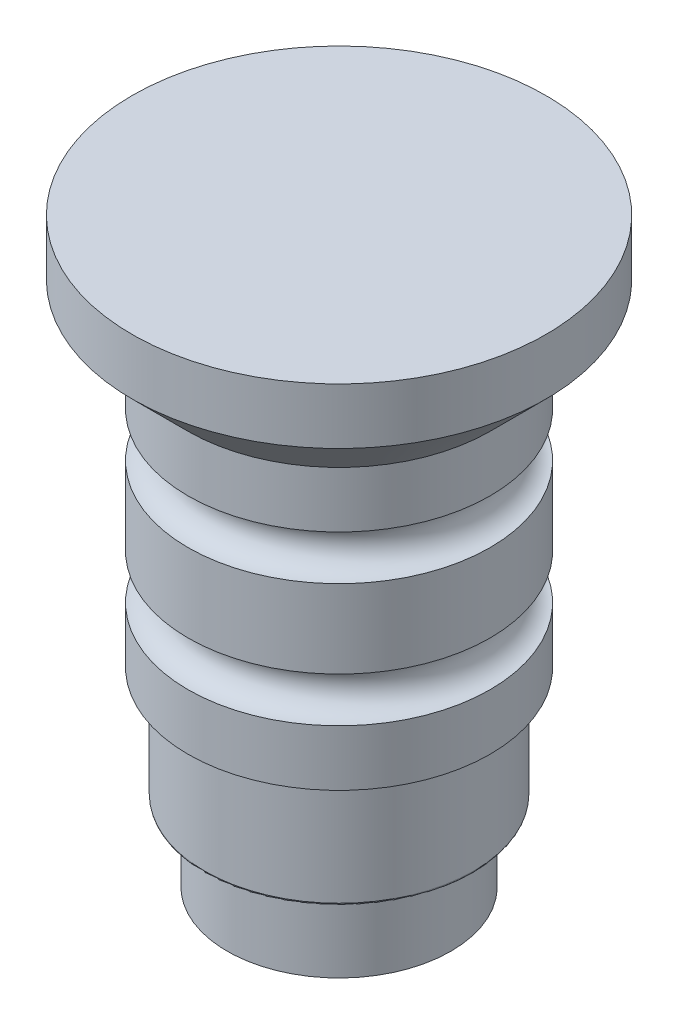
ISO-10303-21;
HEADER;
FILE_DESCRIPTION(('STEP AP214'),'2;1');
FILE_NAME('part.step','',(''),(''),'','','');
FILE_SCHEMA(('AUTOMOTIVE_DESIGN { 1 0 10303 214 1 1 1 1 }'));
ENDSEC;
DATA;
#1=APPLICATION_CONTEXT('core data for automotive mechanical design processes');
#2=APPLICATION_PROTOCOL_DEFINITION('international standard','automotive_design',2000,#1);
#3=PRODUCT_CONTEXT('',#1,'mechanical');
#4=PRODUCT('Part','Part','',(#3));
#5=PRODUCT_RELATED_PRODUCT_CATEGORY('part','',(#4));
#6=PRODUCT_DEFINITION_FORMATION('','',#4);
#7=PRODUCT_DEFINITION_CONTEXT('part definition',#1,'design');
#8=PRODUCT_DEFINITION('design','',#6,#7);
#9=PRODUCT_DEFINITION_SHAPE('','',#8);
#10=(LENGTH_UNIT() NAMED_UNIT(*) SI_UNIT(.MILLI.,.METRE.));
#11=(NAMED_UNIT(*) PLANE_ANGLE_UNIT() SI_UNIT($,.RADIAN.));
#12=(NAMED_UNIT(*) SI_UNIT($,.STERADIAN.) SOLID_ANGLE_UNIT());
#13=UNCERTAINTY_MEASURE_WITH_UNIT(LENGTH_MEASURE(1.E-05),#10,'distance_accuracy_value','');
#14=(GEOMETRIC_REPRESENTATION_CONTEXT(3) GLOBAL_UNCERTAINTY_ASSIGNED_CONTEXT((#13)) GLOBAL_UNIT_ASSIGNED_CONTEXT((#10,
#11,#12)) REPRESENTATION_CONTEXT('',''));
#15=CARTESIAN_POINT('',(0.,0.,0.));
#16=DIRECTION('',(0.,0.,1.));
#17=DIRECTION('',(1.,0.,0.));
#18=AXIS2_PLACEMENT_3D('',#15,#16,#17);
#19=CARTESIAN_POINT('',(-18.5000000000001,52.,0.));
#20=DIRECTION('',(0.,1.,0.));
#21=DIRECTION('',(-1.,0.,0.));
#22=AXIS2_PLACEMENT_3D('',#19,#20,#21);
#23=PLANE('',#22);
#24=CARTESIAN_POINT('',(0.,52.,0.));
#25=DIRECTION('',(0.,1.,0.));
#26=DIRECTION('',(-1.,0.,0.));
#27=AXIS2_PLACEMENT_3D('',#24,#25,#26);
#28=CIRCLE('',#27,18.5000000000001);
#29=CARTESIAN_POINT('',(-18.5000000000001,52.,0.));
#30=VERTEX_POINT('',#29);
#31=EDGE_CURVE('E84',#30,#30,#28,.T.);
#32=ORIENTED_EDGE('',*,*,#31,.T.);
#33=EDGE_LOOP('',(#32));
#34=FACE_BOUND('',#33,.T.);
#35=ADVANCED_FACE('F31',(#34),#23,.T.);
#36=CARTESIAN_POINT('',(-7.5,12.,0.));
#37=DIRECTION('',(0.,-1.,0.));
#38=DIRECTION('',(1.,0.,0.));
#39=AXIS2_PLACEMENT_3D('',#36,#37,#38);
#40=PLANE('',#39);
#41=CARTESIAN_POINT('',(0.,12.,0.));
#42=DIRECTION('',(0.,1.,0.));
#43=DIRECTION('',(-1.,0.,0.));
#44=AXIS2_PLACEMENT_3D('',#41,#42,#43);
#45=CIRCLE('',#44,7.5);
#46=CARTESIAN_POINT('',(-7.5,12.,0.));
#47=VERTEX_POINT('',#46);
#48=EDGE_CURVE('E51',#47,#47,#45,.T.);
#49=ORIENTED_EDGE('',*,*,#48,.F.);
#50=EDGE_LOOP('',(#49));
#51=FACE_BOUND('',#50,.T.);
#52=ADVANCED_FACE('F104',(#51),#40,.T.);
#53=CARTESIAN_POINT('',(0.,42.,0.));
#54=DIRECTION('',(0.,1.,0.));
#55=DIRECTION('',(-1.,0.,0.));
#56=AXIS2_PLACEMENT_3D('',#53,#54,#55);
#57=CYLINDRICAL_SURFACE('',#56,7.5);
#58=ORIENTED_EDGE('',*,*,#48,.T.);
#59=EDGE_LOOP('',(#58));
#60=FACE_BOUND('',#59,.T.);
#61=CARTESIAN_POINT('',(0.,0.,0.));
#62=DIRECTION('',(0.,1.,0.));
#63=DIRECTION('',(-1.,0.,0.));
#64=AXIS2_PLACEMENT_3D('',#61,#62,#63);
#65=CIRCLE('',#64,7.5);
#66=CARTESIAN_POINT('',(-7.5,0.,0.));
#67=VERTEX_POINT('',#66);
#68=EDGE_CURVE('E54',#67,#67,#65,.T.);
#69=ORIENTED_EDGE('',*,*,#68,.F.);
#70=EDGE_LOOP('',(#69));
#71=FACE_BOUND('',#70,.T.);
#72=ADVANCED_FACE('F109',(#60,#71),#57,.F.);
#73=CARTESIAN_POINT('',(-7.5,0.,0.));
#74=DIRECTION('',(0.,-1.,0.));
#75=DIRECTION('',(1.,0.,0.));
#76=AXIS2_PLACEMENT_3D('',#73,#74,#75);
#77=PLANE('',#76);
#78=ORIENTED_EDGE('',*,*,#68,.T.);
#79=EDGE_LOOP('',(#78));
#80=FACE_BOUND('',#79,.T.);
#81=CARTESIAN_POINT('',(0.,0.,0.));
#82=DIRECTION('',(0.,1.,0.));
#83=DIRECTION('',(-1.,0.,0.));
#84=AXIS2_PLACEMENT_3D('',#81,#82,#83);
#85=CIRCLE('',#84,10.);
#86=CARTESIAN_POINT('',(-10.,0.,0.));
#87=VERTEX_POINT('',#86);
#88=EDGE_CURVE('E57',#87,#87,#85,.T.);
#89=ORIENTED_EDGE('',*,*,#88,.F.);
#90=EDGE_LOOP('',(#89));
#91=FACE_BOUND('',#90,.T.);
#92=ADVANCED_FACE('F115',(#80,#91),#77,.T.);
#93=CARTESIAN_POINT('',(0.,42.,0.));
#94=DIRECTION('',(0.,1.,0.));
#95=DIRECTION('',(-1.,0.,0.));
#96=AXIS2_PLACEMENT_3D('',#93,#94,#95);
#97=CYLINDRICAL_SURFACE('',#96,10.);
#98=CARTESIAN_POINT('',(0.,6.8,0.));
#99=DIRECTION('',(0.,-1.,0.));
#100=DIRECTION('',(1.,0.,0.));
#101=AXIS2_PLACEMENT_3D('',#98,#99,#100);
#102=CIRCLE('',#101,10.);
#103=CARTESIAN_POINT('',(10.,6.8,0.));
#104=VERTEX_POINT('',#103);
#105=EDGE_CURVE('E38',#104,#104,#102,.T.);
#106=ORIENTED_EDGE('',*,*,#105,.T.);
#107=EDGE_LOOP('',(#106));
#108=FACE_BOUND('',#107,.T.);
#109=ORIENTED_EDGE('',*,*,#88,.T.);
#110=EDGE_LOOP('',(#109));
#111=FACE_BOUND('',#110,.T.);
#112=ADVANCED_FACE('F119',(#108,#111),#97,.T.);
#113=CARTESIAN_POINT('',(-10.,7.,0.));
#114=DIRECTION('',(0.,-1.,0.));
#115=DIRECTION('',(1.,0.,0.));
#116=AXIS2_PLACEMENT_3D('',#113,#114,#115);
#117=PLANE('',#116);
#118=CARTESIAN_POINT('',(0.,7.,0.));
#119=DIRECTION('',(0.,-1.,0.));
#120=DIRECTION('',(1.,0.,0.));
#121=AXIS2_PLACEMENT_3D('',#118,#119,#120);
#122=CIRCLE('',#121,10.2);
#123=CARTESIAN_POINT('',(10.2,7.,0.));
#124=VERTEX_POINT('',#123);
#125=EDGE_CURVE('E42',#124,#124,#122,.F.);
#126=ORIENTED_EDGE('',*,*,#125,.T.);
#127=EDGE_LOOP('',(#126));
#128=FACE_BOUND('',#127,.T.);
#129=CARTESIAN_POINT('',(0.,7.,0.));
#130=DIRECTION('',(0.,-1.,0.));
#131=DIRECTION('',(1.,0.,0.));
#132=AXIS2_PLACEMENT_3D('',#129,#130,#131);
#133=CIRCLE('',#132,11.8);
#134=CARTESIAN_POINT('',(11.8,7.,0.));
#135=VERTEX_POINT('',#134);
#136=EDGE_CURVE('E46',#135,#135,#133,.T.);
#137=ORIENTED_EDGE('',*,*,#136,.T.);
#138=EDGE_LOOP('',(#137));
#139=FACE_BOUND('',#138,.T.);
#140=ADVANCED_FACE('F123',(#128,#139),#117,.T.);
#141=CARTESIAN_POINT('',(0.,42.,0.));
#142=DIRECTION('',(0.,1.,0.));
#143=DIRECTION('',(-1.,0.,0.));
#144=AXIS2_PLACEMENT_3D('',#141,#142,#143);
#145=CYLINDRICAL_SURFACE('',#144,12.);
#146=CARTESIAN_POINT('',(0.,7.2,0.));
#147=DIRECTION('',(0.,-1.,0.));
#148=DIRECTION('',(1.,0.,0.));
#149=AXIS2_PLACEMENT_3D('',#146,#147,#148);
#150=CIRCLE('',#149,12.);
#151=CARTESIAN_POINT('',(12.,7.2,0.));
#152=VERTEX_POINT('',#151);
#153=EDGE_CURVE('E10',#152,#152,#150,.F.);
#154=ORIENTED_EDGE('',*,*,#153,.T.);
#155=EDGE_LOOP('',(#154));
#156=FACE_BOUND('',#155,.T.);
#157=CARTESIAN_POINT('',(0.,17.,0.));
#158=DIRECTION('',(0.,1.,0.));
#159=DIRECTION('',(-1.,0.,0.));
#160=AXIS2_PLACEMENT_3D('',#157,#158,#159);
#161=CIRCLE('',#160,12.);
#162=CARTESIAN_POINT('',(-12.,17.,0.));
#163=VERTEX_POINT('',#162);
#164=EDGE_CURVE('E60',#163,#163,#161,.T.);
#165=ORIENTED_EDGE('',*,*,#164,.F.);
#166=EDGE_LOOP('',(#165));
#167=FACE_BOUND('',#166,.T.);
#168=ADVANCED_FACE('F126',(#156,#167),#145,.T.);
#169=CARTESIAN_POINT('',(-12.,17.,0.));
#170=DIRECTION('',(0.,-1.,0.));
#171=DIRECTION('',(1.,0.,0.));
#172=AXIS2_PLACEMENT_3D('',#169,#170,#171);
#173=PLANE('',#172);
#174=ORIENTED_EDGE('',*,*,#164,.T.);
#175=EDGE_LOOP('',(#174));
#176=FACE_BOUND('',#175,.T.);
#177=CARTESIAN_POINT('',(0.,17.,0.));
#178=DIRECTION('',(0.,1.,0.));
#179=DIRECTION('',(-1.,0.,0.));
#180=AXIS2_PLACEMENT_3D('',#177,#178,#179);
#181=CIRCLE('',#180,13.5);
#182=CARTESIAN_POINT('',(-13.5,17.,0.));
#183=VERTEX_POINT('',#182);
#184=EDGE_CURVE('E63',#183,#183,#181,.T.);
#185=ORIENTED_EDGE('',*,*,#184,.F.);
#186=EDGE_LOOP('',(#185));
#187=FACE_BOUND('',#186,.T.);
#188=ADVANCED_FACE('F130',(#176,#187),#173,.T.);
#189=CARTESIAN_POINT('',(0.,42.,0.));
#190=DIRECTION('',(0.,1.,0.));
#191=DIRECTION('',(-1.,0.,0.));
#192=AXIS2_PLACEMENT_3D('',#189,#190,#191);
#193=CYLINDRICAL_SURFACE('',#192,13.5);
#194=ORIENTED_EDGE('',*,*,#184,.T.);
#195=EDGE_LOOP('',(#194));
#196=FACE_BOUND('',#195,.T.);
#197=CARTESIAN_POINT('',(0.,22.,0.));
#198=DIRECTION('',(0.,1.,0.));
#199=DIRECTION('',(-1.,0.,0.));
#200=AXIS2_PLACEMENT_3D('',#197,#198,#199);
#201=CIRCLE('',#200,13.5);
#202=CARTESIAN_POINT('',(-13.5,22.,0.));
#203=VERTEX_POINT('',#202);
#204=EDGE_CURVE('E66',#203,#203,#201,.T.);
#205=ORIENTED_EDGE('',*,*,#204,.F.);
#206=EDGE_LOOP('',(#205));
#207=FACE_BOUND('',#206,.T.);
#208=ADVANCED_FACE('F133',(#196,#207),#193,.T.);
#209=CARTESIAN_POINT('',(0.,24.,0.));
#210=DIRECTION('',(0.,1.,0.));
#211=DIRECTION('',(-1.,0.,0.));
#212=AXIS2_PLACEMENT_3D('',#209,#210,#211);
#213=TOROIDAL_SURFACE('',#212,13.5,2.);
#214=ORIENTED_EDGE('',*,*,#204,.T.);
#215=EDGE_LOOP('',(#214));
#216=FACE_BOUND('',#215,.T.);
#217=CARTESIAN_POINT('',(0.,26.,0.));
#218=DIRECTION('',(0.,1.,0.));
#219=DIRECTION('',(-1.,0.,0.));
#220=AXIS2_PLACEMENT_3D('',#217,#218,#219);
#221=CIRCLE('',#220,13.5);
#222=CARTESIAN_POINT('',(-13.5,26.,0.));
#223=VERTEX_POINT('',#222);
#224=EDGE_CURVE('E69',#223,#223,#221,.T.);
#225=ORIENTED_EDGE('',*,*,#224,.F.);
#226=EDGE_LOOP('',(#225));
#227=FACE_BOUND('',#226,.T.);
#228=ADVANCED_FACE('F137',(#216,#227),#213,.F.);
#229=CARTESIAN_POINT('',(0.,42.,0.));
#230=DIRECTION('',(0.,1.,0.));
#231=DIRECTION('',(-1.,0.,0.));
#232=AXIS2_PLACEMENT_3D('',#229,#230,#231);
#233=CYLINDRICAL_SURFACE('',#232,13.5);
#234=ORIENTED_EDGE('',*,*,#224,.T.);
#235=EDGE_LOOP('',(#234));
#236=FACE_BOUND('',#235,.T.);
#237=CARTESIAN_POINT('',(0.,33.,0.));
#238=DIRECTION('',(0.,1.,0.));
#239=DIRECTION('',(-1.,0.,0.));
#240=AXIS2_PLACEMENT_3D('',#237,#238,#239);
#241=CIRCLE('',#240,13.5);
#242=CARTESIAN_POINT('',(-13.5,33.,0.));
#243=VERTEX_POINT('',#242);
#244=EDGE_CURVE('E72',#243,#243,#241,.T.);
#245=ORIENTED_EDGE('',*,*,#244,.F.);
#246=EDGE_LOOP('',(#245));
#247=FACE_BOUND('',#246,.T.);
#248=ADVANCED_FACE('F141',(#236,#247),#233,.T.);
#249=CARTESIAN_POINT('',(0.,35.,0.));
#250=DIRECTION('',(0.,1.,0.));
#251=DIRECTION('',(-1.,0.,0.));
#252=AXIS2_PLACEMENT_3D('',#249,#250,#251);
#253=TOROIDAL_SURFACE('',#252,13.5,2.);
#254=ORIENTED_EDGE('',*,*,#244,.T.);
#255=EDGE_LOOP('',(#254));
#256=FACE_BOUND('',#255,.T.);
#257=CARTESIAN_POINT('',(0.,37.,0.));
#258=DIRECTION('',(0.,1.,0.));
#259=DIRECTION('',(-1.,0.,0.));
#260=AXIS2_PLACEMENT_3D('',#257,#258,#259);
#261=CIRCLE('',#260,13.5);
#262=CARTESIAN_POINT('',(-13.5,37.,0.));
#263=VERTEX_POINT('',#262);
#264=EDGE_CURVE('E75',#263,#263,#261,.T.);
#265=ORIENTED_EDGE('',*,*,#264,.F.);
#266=EDGE_LOOP('',(#265));
#267=FACE_BOUND('',#266,.T.);
#268=ADVANCED_FACE('F145',(#256,#267),#253,.F.);
#269=CARTESIAN_POINT('',(0.,42.,0.));
#270=DIRECTION('',(0.,1.,0.));
#271=DIRECTION('',(-1.,0.,0.));
#272=AXIS2_PLACEMENT_3D('',#269,#270,#271);
#273=CYLINDRICAL_SURFACE('',#272,13.5);
#274=ORIENTED_EDGE('',*,*,#264,.T.);
#275=EDGE_LOOP('',(#274));
#276=FACE_BOUND('',#275,.T.);
#277=CARTESIAN_POINT('',(0.,42.,0.));
#278=DIRECTION('',(0.,1.,0.));
#279=DIRECTION('',(-1.,0.,0.));
#280=AXIS2_PLACEMENT_3D('',#277,#278,#279);
#281=CIRCLE('',#280,13.5);
#282=CARTESIAN_POINT('',(-13.5,42.,0.));
#283=VERTEX_POINT('',#282);
#284=EDGE_CURVE('E78',#283,#283,#281,.T.);
#285=ORIENTED_EDGE('',*,*,#284,.F.);
#286=EDGE_LOOP('',(#285));
#287=FACE_BOUND('',#286,.T.);
#288=ADVANCED_FACE('F100',(#276,#287),#273,.T.);
#289=CARTESIAN_POINT('',(0.,47.,0.));
#290=DIRECTION('',(0.,1.,0.));
#291=DIRECTION('',(-1.,0.,0.));
#292=AXIS2_PLACEMENT_3D('',#289,#290,#291);
#293=CONICAL_SURFACE('',#292,18.5000000000001,0.785398163397453);
#294=ORIENTED_EDGE('',*,*,#284,.T.);
#295=EDGE_LOOP('',(#294));
#296=FACE_BOUND('',#295,.T.);
#297=CARTESIAN_POINT('',(0.,47.,0.));
#298=DIRECTION('',(0.,1.,0.));
#299=DIRECTION('',(-1.,0.,0.));
#300=AXIS2_PLACEMENT_3D('',#297,#298,#299);
#301=CIRCLE('',#300,18.5000000000001);
#302=CARTESIAN_POINT('',(-18.5000000000001,47.,0.));
#303=VERTEX_POINT('',#302);
#304=EDGE_CURVE('E81',#303,#303,#301,.T.);
#305=ORIENTED_EDGE('',*,*,#304,.F.);
#306=EDGE_LOOP('',(#305));
#307=FACE_BOUND('',#306,.T.);
#308=ADVANCED_FACE('F92',(#296,#307),#293,.T.);
#309=CARTESIAN_POINT('',(0.,42.,0.));
#310=DIRECTION('',(0.,1.,0.));
#311=DIRECTION('',(-1.,0.,0.));
#312=AXIS2_PLACEMENT_3D('',#309,#310,#311);
#313=CYLINDRICAL_SURFACE('',#312,18.5000000000001);
#314=ORIENTED_EDGE('',*,*,#304,.T.);
#315=EDGE_LOOP('',(#314));
#316=FACE_BOUND('',#315,.T.);
#317=ORIENTED_EDGE('',*,*,#31,.F.);
#318=EDGE_LOOP('',(#317));
#319=FACE_BOUND('',#318,.T.);
#320=ADVANCED_FACE('F89',(#316,#319),#313,.T.);
#321=CARTESIAN_POINT('',(0.,6.8,0.));
#322=DIRECTION('',(0.,-1.,0.));
#323=DIRECTION('',(1.,0.,0.));
#324=AXIS2_PLACEMENT_3D('',#321,#322,#323);
#325=TOROIDAL_SURFACE('',#324,10.2,0.2);
#326=ORIENTED_EDGE('',*,*,#105,.F.);
#327=EDGE_LOOP('',(#326));
#328=FACE_BOUND('',#327,.T.);
#329=ORIENTED_EDGE('',*,*,#125,.F.);
#330=EDGE_LOOP('',(#329));
#331=FACE_BOUND('',#330,.T.);
#332=ADVANCED_FACE('F91',(#328,#331),#325,.F.);
#333=CARTESIAN_POINT('',(0.,7.2,0.));
#334=DIRECTION('',(0.,-1.,0.));
#335=DIRECTION('',(1.,0.,0.));
#336=AXIS2_PLACEMENT_3D('',#333,#334,#335);
#337=TOROIDAL_SURFACE('',#336,11.8,0.2);
#338=ORIENTED_EDGE('',*,*,#136,.F.);
#339=EDGE_LOOP('',(#338));
#340=FACE_BOUND('',#339,.T.);
#341=ORIENTED_EDGE('',*,*,#153,.F.);
#342=EDGE_LOOP('',(#341));
#343=FACE_BOUND('',#342,.T.);
#344=ADVANCED_FACE('F33',(#340,#343),#337,.T.);
#345=CLOSED_SHELL('',(#35,#52,#72,#92,#112,#140,#168,#188,#208,#228,#248,#268,#288,#308,#320,
#332,#344));
#346=MANIFOLD_SOLID_BREP('B2',#345);
#347=ADVANCED_BREP_SHAPE_REPRESENTATION('',(#18,#346),#14);
#348=SHAPE_DEFINITION_REPRESENTATION(#9,#347);
ENDSEC;
END-ISO-10303-21;
